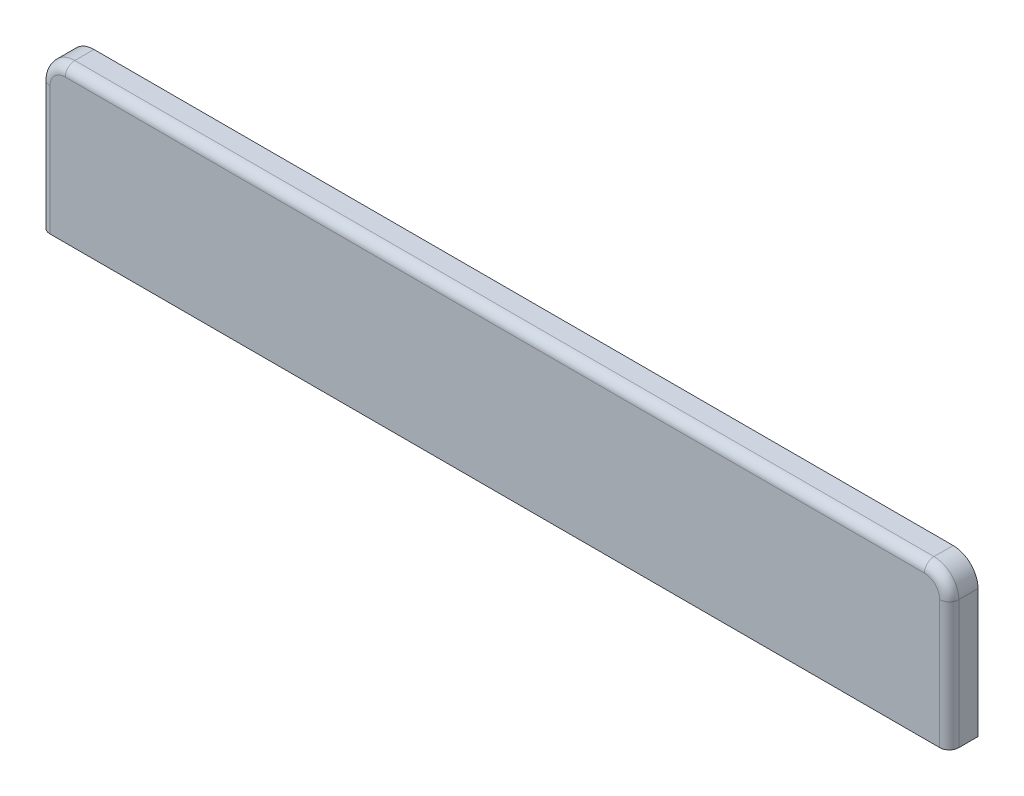
ISO-10303-21;
HEADER;
FILE_DESCRIPTION(('STEP AP214'),'2;1');
FILE_NAME('part.step','',(''),(''),'','','');
FILE_SCHEMA(('AUTOMOTIVE_DESIGN { 1 0 10303 214 1 1 1 1 }'));
ENDSEC;
DATA;
#1=APPLICATION_CONTEXT('core data for automotive mechanical design processes');
#2=APPLICATION_PROTOCOL_DEFINITION('international standard','automotive_design',2000,#1);
#3=PRODUCT_CONTEXT('',#1,'mechanical');
#4=PRODUCT('Part','Part','',(#3));
#5=PRODUCT_RELATED_PRODUCT_CATEGORY('part','',(#4));
#6=PRODUCT_DEFINITION_FORMATION('','',#4);
#7=PRODUCT_DEFINITION_CONTEXT('part definition',#1,'design');
#8=PRODUCT_DEFINITION('design','',#6,#7);
#9=PRODUCT_DEFINITION_SHAPE('','',#8);
#10=(LENGTH_UNIT() NAMED_UNIT(*) SI_UNIT(.MILLI.,.METRE.));
#11=(NAMED_UNIT(*) PLANE_ANGLE_UNIT() SI_UNIT($,.RADIAN.));
#12=(NAMED_UNIT(*) SI_UNIT($,.STERADIAN.) SOLID_ANGLE_UNIT());
#13=UNCERTAINTY_MEASURE_WITH_UNIT(LENGTH_MEASURE(1.E-05),#10,'distance_accuracy_value','');
#14=(GEOMETRIC_REPRESENTATION_CONTEXT(3) GLOBAL_UNCERTAINTY_ASSIGNED_CONTEXT((#13)) GLOBAL_UNIT_ASSIGNED_CONTEXT((#10,
#11,#12)) REPRESENTATION_CONTEXT('',''));
#15=CARTESIAN_POINT('',(0.,0.,0.));
#16=DIRECTION('',(0.,0.,1.));
#17=DIRECTION('',(1.,0.,0.));
#18=AXIS2_PLACEMENT_3D('',#15,#16,#17);
#19=CARTESIAN_POINT('',(301.625,101.6,19.05));
#20=DIRECTION('',(0.,-1.,0.));
#21=DIRECTION('',(1.,0.,0.));
#22=AXIS2_PLACEMENT_3D('',#19,#20,#21);
#23=PLANE('',#22);
#24=DIRECTION('',(0.,0.,-1.));
#25=VECTOR('',#24,1.);
#26=CARTESIAN_POINT('',(-285.115,101.6,19.05));
#27=LINE('',#26,#25);
#28=CARTESIAN_POINT('',(-285.115,101.6,0.));
#29=VERTEX_POINT('',#28);
#30=CARTESIAN_POINT('',(-285.115,101.6,12.7));
#31=VERTEX_POINT('',#30);
#32=EDGE_CURVE('E150',#29,#31,#27,.F.);
#33=ORIENTED_EDGE('',*,*,#32,.T.);
#34=DIRECTION('',(-1.,0.,0.));
#35=VECTOR('',#34,1.);
#36=CARTESIAN_POINT('',(285.115,101.6,12.7));
#37=LINE('',#36,#35);
#38=CARTESIAN_POINT('',(285.115,101.6,12.7));
#39=VERTEX_POINT('',#38);
#40=EDGE_CURVE('E174',#31,#39,#37,.F.);
#41=ORIENTED_EDGE('',*,*,#40,.T.);
#42=DIRECTION('',(0.,0.,-1.));
#43=VECTOR('',#42,1.);
#44=CARTESIAN_POINT('',(285.115,101.6,19.05));
#45=LINE('',#44,#43);
#46=CARTESIAN_POINT('',(285.115,101.6,0.));
#47=VERTEX_POINT('',#46);
#48=EDGE_CURVE('E148',#39,#47,#45,.T.);
#49=ORIENTED_EDGE('',*,*,#48,.T.);
#50=DIRECTION('',(-1.,0.,0.));
#51=VECTOR('',#50,1.);
#52=CARTESIAN_POINT('',(301.625,101.6,0.));
#53=LINE('',#52,#51);
#54=EDGE_CURVE('E128',#47,#29,#53,.T.);
#55=ORIENTED_EDGE('',*,*,#54,.T.);
#56=EDGE_LOOP('',(#33,#41,#49,#55));
#57=FACE_BOUND('',#56,.T.);
#58=ADVANCED_FACE('F36',(#57),#23,.F.);
#59=CARTESIAN_POINT('',(-301.625,101.6,19.05));
#60=DIRECTION('',(1.,0.,0.));
#61=DIRECTION('',(0.,0.,-1.));
#62=AXIS2_PLACEMENT_3D('',#59,#60,#61);
#63=PLANE('',#62);
#64=DIRECTION('',(0.,0.,-1.));
#65=VECTOR('',#64,1.);
#66=CARTESIAN_POINT('',(-301.625,0.,19.05));
#67=LINE('',#66,#65);
#68=CARTESIAN_POINT('',(-301.625,0.,12.7));
#69=VERTEX_POINT('',#68);
#70=CARTESIAN_POINT('',(-301.625,0.,0.));
#71=VERTEX_POINT('',#70);
#72=EDGE_CURVE('E108',#69,#71,#67,.T.);
#73=ORIENTED_EDGE('',*,*,#72,.F.);
#74=DIRECTION('',(0.,-1.,0.));
#75=VECTOR('',#74,1.);
#76=CARTESIAN_POINT('',(-301.625,85.09,12.7));
#77=LINE('',#76,#75);
#78=CARTESIAN_POINT('',(-301.625,85.09,12.7));
#79=VERTEX_POINT('',#78);
#80=EDGE_CURVE('E11',#69,#79,#77,.F.);
#81=ORIENTED_EDGE('',*,*,#80,.T.);
#82=DIRECTION('',(0.,0.,-1.));
#83=VECTOR('',#82,1.);
#84=CARTESIAN_POINT('',(-301.625,85.09,19.05));
#85=LINE('',#84,#83);
#86=CARTESIAN_POINT('',(-301.625,85.09,0.));
#87=VERTEX_POINT('',#86);
#88=EDGE_CURVE('E119',#79,#87,#85,.T.);
#89=ORIENTED_EDGE('',*,*,#88,.T.);
#90=DIRECTION('',(0.,-1.,0.));
#91=VECTOR('',#90,1.);
#92=CARTESIAN_POINT('',(-301.625,101.6,0.));
#93=LINE('',#92,#91);
#94=EDGE_CURVE('E123',#87,#71,#93,.T.);
#95=ORIENTED_EDGE('',*,*,#94,.T.);
#96=EDGE_LOOP('',(#73,#81,#89,#95));
#97=FACE_BOUND('',#96,.T.);
#98=ADVANCED_FACE('F124',(#97),#63,.F.);
#99=CARTESIAN_POINT('',(301.625,0.,19.05));
#100=DIRECTION('',(0.,1.,0.));
#101=DIRECTION('',(-1.,0.,0.));
#102=AXIS2_PLACEMENT_3D('',#99,#100,#101);
#103=PLANE('',#102);
#104=DIRECTION('',(0.,0.,-1.));
#105=VECTOR('',#104,1.);
#106=CARTESIAN_POINT('',(301.625,0.,19.05));
#107=LINE('',#106,#105);
#108=CARTESIAN_POINT('',(301.625,0.,12.7));
#109=VERTEX_POINT('',#108);
#110=CARTESIAN_POINT('',(301.625,0.,0.));
#111=VERTEX_POINT('',#110);
#112=EDGE_CURVE('E120',#109,#111,#107,.T.);
#113=ORIENTED_EDGE('',*,*,#112,.F.);
#114=CARTESIAN_POINT('',(295.275,0.,12.7));
#115=DIRECTION('',(0.,1.,0.));
#116=DIRECTION('',(-1.,0.,0.));
#117=AXIS2_PLACEMENT_3D('',#114,#115,#116);
#118=CIRCLE('',#117,6.35);
#119=CARTESIAN_POINT('',(295.275,0.,19.05));
#120=VERTEX_POINT('',#119);
#121=EDGE_CURVE('E170',#109,#120,#118,.F.);
#122=ORIENTED_EDGE('',*,*,#121,.T.);
#123=DIRECTION('',(1.,0.,0.));
#124=VECTOR('',#123,1.);
#125=CARTESIAN_POINT('',(301.625,0.,19.05));
#126=LINE('',#125,#124);
#127=CARTESIAN_POINT('',(-295.275,0.,19.05));
#128=VERTEX_POINT('',#127);
#129=EDGE_CURVE('E138',#128,#120,#126,.T.);
#130=ORIENTED_EDGE('',*,*,#129,.F.);
#131=CARTESIAN_POINT('',(-295.275,0.,12.7));
#132=DIRECTION('',(0.,1.,0.));
#133=DIRECTION('',(-1.,0.,0.));
#134=AXIS2_PLACEMENT_3D('',#131,#132,#133);
#135=CIRCLE('',#134,6.35);
#136=EDGE_CURVE('E117',#128,#69,#135,.F.);
#137=ORIENTED_EDGE('',*,*,#136,.T.);
#138=ORIENTED_EDGE('',*,*,#72,.T.);
#139=DIRECTION('',(1.,0.,0.));
#140=VECTOR('',#139,1.);
#141=CARTESIAN_POINT('',(301.625,0.,0.));
#142=LINE('',#141,#140);
#143=EDGE_CURVE('E113',#71,#111,#142,.T.);
#144=ORIENTED_EDGE('',*,*,#143,.T.);
#145=EDGE_LOOP('',(#113,#122,#130,#137,#138,#144));
#146=FACE_BOUND('',#145,.T.);
#147=ADVANCED_FACE('F111',(#146),#103,.F.);
#148=CARTESIAN_POINT('',(301.625,101.6,19.05));
#149=DIRECTION('',(-1.,0.,0.));
#150=DIRECTION('',(0.,0.,1.));
#151=AXIS2_PLACEMENT_3D('',#148,#149,#150);
#152=PLANE('',#151);
#153=DIRECTION('',(0.,0.,-1.));
#154=VECTOR('',#153,1.);
#155=CARTESIAN_POINT('',(301.625,85.0899999999999,19.05));
#156=LINE('',#155,#154);
#157=CARTESIAN_POINT('',(301.625,85.0899999999999,0.));
#158=VERTEX_POINT('',#157);
#159=CARTESIAN_POINT('',(301.625,85.0899999999999,12.7));
#160=VERTEX_POINT('',#159);
#161=EDGE_CURVE('E152',#158,#160,#156,.F.);
#162=ORIENTED_EDGE('',*,*,#161,.T.);
#163=DIRECTION('',(0.,1.,0.));
#164=VECTOR('',#163,1.);
#165=CARTESIAN_POINT('',(301.625,0.,12.7));
#166=LINE('',#165,#164);
#167=EDGE_CURVE('E167',#160,#109,#166,.F.);
#168=ORIENTED_EDGE('',*,*,#167,.T.);
#169=ORIENTED_EDGE('',*,*,#112,.T.);
#170=DIRECTION('',(0.,1.,0.));
#171=VECTOR('',#170,1.);
#172=CARTESIAN_POINT('',(301.625,101.6,0.));
#173=LINE('',#172,#171);
#174=EDGE_CURVE('E132',#111,#158,#173,.T.);
#175=ORIENTED_EDGE('',*,*,#174,.T.);
#176=EDGE_LOOP('',(#162,#168,#169,#175));
#177=FACE_BOUND('',#176,.T.);
#178=ADVANCED_FACE('F221',(#177),#152,.F.);
#179=CARTESIAN_POINT('',(0.,0.,19.05));
#180=DIRECTION('',(0.,0.,1.));
#181=DIRECTION('',(1.,0.,0.));
#182=AXIS2_PLACEMENT_3D('',#179,#180,#181);
#183=PLANE('',#182);
#184=ORIENTED_EDGE('',*,*,#129,.T.);
#185=DIRECTION('',(0.,1.,0.));
#186=VECTOR('',#185,1.);
#187=CARTESIAN_POINT('',(295.275,85.0899999999999,19.05));
#188=LINE('',#187,#186);
#189=CARTESIAN_POINT('',(295.275,85.0899999999999,19.05));
#190=VERTEX_POINT('',#189);
#191=EDGE_CURVE('E164',#120,#190,#188,.T.);
#192=ORIENTED_EDGE('',*,*,#191,.T.);
#193=CARTESIAN_POINT('',(285.115,85.0899999999999,19.05));
#194=DIRECTION('',(0.,0.,1.));
#195=DIRECTION('',(1.,0.,0.));
#196=AXIS2_PLACEMENT_3D('',#193,#194,#195);
#197=CIRCLE('',#196,10.16);
#198=CARTESIAN_POINT('',(285.115,95.2499999999999,19.05));
#199=VERTEX_POINT('',#198);
#200=EDGE_CURVE('E162',#190,#199,#197,.T.);
#201=ORIENTED_EDGE('',*,*,#200,.T.);
#202=DIRECTION('',(-1.,0.,0.));
#203=VECTOR('',#202,1.);
#204=CARTESIAN_POINT('',(-285.115,95.25,19.05));
#205=LINE('',#204,#203);
#206=CARTESIAN_POINT('',(-285.115,95.25,19.05));
#207=VERTEX_POINT('',#206);
#208=EDGE_CURVE('E159',#199,#207,#205,.T.);
#209=ORIENTED_EDGE('',*,*,#208,.T.);
#210=CARTESIAN_POINT('',(-285.115,85.09,19.05));
#211=DIRECTION('',(0.,0.,1.));
#212=DIRECTION('',(1.,0.,0.));
#213=AXIS2_PLACEMENT_3D('',#210,#211,#212);
#214=CIRCLE('',#213,10.16);
#215=CARTESIAN_POINT('',(-295.275,85.09,19.05));
#216=VERTEX_POINT('',#215);
#217=EDGE_CURVE('E157',#207,#216,#214,.T.);
#218=ORIENTED_EDGE('',*,*,#217,.T.);
#219=DIRECTION('',(0.,-1.,0.));
#220=VECTOR('',#219,1.);
#221=CARTESIAN_POINT('',(-295.275,0.,19.05));
#222=LINE('',#221,#220);
#223=EDGE_CURVE('E155',#216,#128,#222,.T.);
#224=ORIENTED_EDGE('',*,*,#223,.T.);
#225=EDGE_LOOP('',(#184,#192,#201,#209,#218,#224));
#226=FACE_BOUND('',#225,.T.);
#227=ADVANCED_FACE('F202',(#226),#183,.T.);
#228=CARTESIAN_POINT('',(0.,0.,0.));
#229=DIRECTION('',(0.,0.,1.));
#230=DIRECTION('',(1.,0.,0.));
#231=AXIS2_PLACEMENT_3D('',#228,#229,#230);
#232=PLANE('',#231);
#233=ORIENTED_EDGE('',*,*,#94,.F.);
#234=CARTESIAN_POINT('',(-285.115,85.09,0.));
#235=DIRECTION('',(0.,0.,1.));
#236=DIRECTION('',(1.,0.,0.));
#237=AXIS2_PLACEMENT_3D('',#234,#235,#236);
#238=CIRCLE('',#237,16.51);
#239=EDGE_CURVE('E146',#87,#29,#238,.F.);
#240=ORIENTED_EDGE('',*,*,#239,.T.);
#241=ORIENTED_EDGE('',*,*,#54,.F.);
#242=CARTESIAN_POINT('',(285.115,85.0899999999999,0.));
#243=DIRECTION('',(0.,0.,1.));
#244=DIRECTION('',(1.,0.,0.));
#245=AXIS2_PLACEMENT_3D('',#242,#243,#244);
#246=CIRCLE('',#245,16.51);
#247=EDGE_CURVE('E144',#47,#158,#246,.F.);
#248=ORIENTED_EDGE('',*,*,#247,.T.);
#249=ORIENTED_EDGE('',*,*,#174,.F.);
#250=ORIENTED_EDGE('',*,*,#143,.F.);
#251=EDGE_LOOP('',(#233,#240,#241,#248,#249,#250));
#252=FACE_BOUND('',#251,.T.);
#253=ADVANCED_FACE('F130',(#252),#232,.F.);
#254=CARTESIAN_POINT('',(-285.115,85.09,19.05));
#255=DIRECTION('',(0.,0.,-1.));
#256=DIRECTION('',(-1.,0.,0.));
#257=AXIS2_PLACEMENT_3D('',#254,#255,#256);
#258=CYLINDRICAL_SURFACE('',#257,16.51);
#259=ORIENTED_EDGE('',*,*,#88,.F.);
#260=CARTESIAN_POINT('',(-285.115,85.09,12.7));
#261=DIRECTION('',(0.,0.,1.));
#262=DIRECTION('',(1.,0.,0.));
#263=AXIS2_PLACEMENT_3D('',#260,#261,#262);
#264=CIRCLE('',#263,16.51);
#265=EDGE_CURVE('E46',#79,#31,#264,.F.);
#266=ORIENTED_EDGE('',*,*,#265,.T.);
#267=ORIENTED_EDGE('',*,*,#32,.F.);
#268=ORIENTED_EDGE('',*,*,#239,.F.);
#269=EDGE_LOOP('',(#259,#266,#267,#268));
#270=FACE_BOUND('',#269,.T.);
#271=ADVANCED_FACE('F238',(#270),#258,.T.);
#272=CARTESIAN_POINT('',(285.115,85.0899999999999,19.05));
#273=DIRECTION('',(0.,0.,-1.));
#274=DIRECTION('',(-1.,0.,0.));
#275=AXIS2_PLACEMENT_3D('',#272,#273,#274);
#276=CYLINDRICAL_SURFACE('',#275,16.51);
#277=ORIENTED_EDGE('',*,*,#48,.F.);
#278=CARTESIAN_POINT('',(285.115,85.0899999999999,12.7));
#279=DIRECTION('',(0.,0.,1.));
#280=DIRECTION('',(1.,0.,0.));
#281=AXIS2_PLACEMENT_3D('',#278,#279,#280);
#282=CIRCLE('',#281,16.51);
#283=EDGE_CURVE('E172',#39,#160,#282,.F.);
#284=ORIENTED_EDGE('',*,*,#283,.T.);
#285=ORIENTED_EDGE('',*,*,#161,.F.);
#286=ORIENTED_EDGE('',*,*,#247,.F.);
#287=EDGE_LOOP('',(#277,#284,#285,#286));
#288=FACE_BOUND('',#287,.T.);
#289=ADVANCED_FACE('F218',(#288),#276,.T.);
#290=CARTESIAN_POINT('',(-295.275,0.,12.7));
#291=DIRECTION('',(0.,1.,0.));
#292=DIRECTION('',(0.,0.,1.));
#293=AXIS2_PLACEMENT_3D('',#290,#291,#292);
#294=CYLINDRICAL_SURFACE('',#293,6.35);
#295=ORIENTED_EDGE('',*,*,#136,.F.);
#296=ORIENTED_EDGE('',*,*,#223,.F.);
#297=CARTESIAN_POINT('',(-295.275,85.09,12.7));
#298=DIRECTION('',(0.,1.,0.));
#299=DIRECTION('',(0.,0.,1.));
#300=AXIS2_PLACEMENT_3D('',#297,#298,#299);
#301=CIRCLE('',#300,6.35);
#302=EDGE_CURVE('E40',#79,#216,#301,.T.);
#303=ORIENTED_EDGE('',*,*,#302,.F.);
#304=ORIENTED_EDGE('',*,*,#80,.F.);
#305=EDGE_LOOP('',(#295,#296,#303,#304));
#306=FACE_BOUND('',#305,.T.);
#307=ADVANCED_FACE('F38',(#306),#294,.T.);
#308=CARTESIAN_POINT('',(-285.115,85.09,12.7));
#309=DIRECTION('',(0.,0.,1.));
#310=DIRECTION('',(1.,0.,0.));
#311=AXIS2_PLACEMENT_3D('',#308,#309,#310);
#312=TOROIDAL_SURFACE('',#311,10.16,6.35);
#313=ORIENTED_EDGE('',*,*,#302,.T.);
#314=ORIENTED_EDGE('',*,*,#217,.F.);
#315=CARTESIAN_POINT('',(-285.115,95.25,12.7));
#316=DIRECTION('',(1.,0.,0.));
#317=DIRECTION('',(0.,0.,-1.));
#318=AXIS2_PLACEMENT_3D('',#315,#316,#317);
#319=CIRCLE('',#318,6.35);
#320=EDGE_CURVE('E182',#31,#207,#319,.T.);
#321=ORIENTED_EDGE('',*,*,#320,.F.);
#322=ORIENTED_EDGE('',*,*,#265,.F.);
#323=EDGE_LOOP('',(#313,#314,#321,#322));
#324=FACE_BOUND('',#323,.T.);
#325=ADVANCED_FACE('F248',(#324),#312,.T.);
#326=CARTESIAN_POINT('',(0.,95.25,12.7));
#327=DIRECTION('',(1.,0.,0.));
#328=DIRECTION('',(0.,1.,0.));
#329=AXIS2_PLACEMENT_3D('',#326,#327,#328);
#330=CYLINDRICAL_SURFACE('',#329,6.35);
#331=ORIENTED_EDGE('',*,*,#320,.T.);
#332=ORIENTED_EDGE('',*,*,#208,.F.);
#333=CARTESIAN_POINT('',(285.115,95.2499999999999,12.7));
#334=DIRECTION('',(1.,0.,0.));
#335=DIRECTION('',(0.,0.,-1.));
#336=AXIS2_PLACEMENT_3D('',#333,#334,#335);
#337=CIRCLE('',#336,6.35);
#338=EDGE_CURVE('E180',#39,#199,#337,.T.);
#339=ORIENTED_EDGE('',*,*,#338,.F.);
#340=ORIENTED_EDGE('',*,*,#40,.F.);
#341=EDGE_LOOP('',(#331,#332,#339,#340));
#342=FACE_BOUND('',#341,.T.);
#343=ADVANCED_FACE('F214',(#342),#330,.T.);
#344=CARTESIAN_POINT('',(285.115,85.0899999999999,12.7));
#345=DIRECTION('',(0.,0.,1.));
#346=DIRECTION('',(1.,0.,0.));
#347=AXIS2_PLACEMENT_3D('',#344,#345,#346);
#348=TOROIDAL_SURFACE('',#347,10.16,6.35);
#349=ORIENTED_EDGE('',*,*,#338,.T.);
#350=ORIENTED_EDGE('',*,*,#200,.F.);
#351=CARTESIAN_POINT('',(295.275,85.0899999999999,12.7));
#352=DIRECTION('',(0.,-1.,0.));
#353=DIRECTION('',(0.,0.,-1.));
#354=AXIS2_PLACEMENT_3D('',#351,#352,#353);
#355=CIRCLE('',#354,6.35);
#356=EDGE_CURVE('E178',#160,#190,#355,.T.);
#357=ORIENTED_EDGE('',*,*,#356,.F.);
#358=ORIENTED_EDGE('',*,*,#283,.F.);
#359=EDGE_LOOP('',(#349,#350,#357,#358));
#360=FACE_BOUND('',#359,.T.);
#361=ADVANCED_FACE('F212',(#360),#348,.T.);
#362=CARTESIAN_POINT('',(295.275,0.,12.7));
#363=DIRECTION('',(0.,-1.,0.));
#364=DIRECTION('',(0.,0.,-1.));
#365=AXIS2_PLACEMENT_3D('',#362,#363,#364);
#366=CYLINDRICAL_SURFACE('',#365,6.35);
#367=ORIENTED_EDGE('',*,*,#121,.F.);
#368=ORIENTED_EDGE('',*,*,#167,.F.);
#369=ORIENTED_EDGE('',*,*,#356,.T.);
#370=ORIENTED_EDGE('',*,*,#191,.F.);
#371=EDGE_LOOP('',(#367,#368,#369,#370));
#372=FACE_BOUND('',#371,.T.);
#373=ADVANCED_FACE('F206',(#372),#366,.T.);
#374=CLOSED_SHELL('',(#58,#98,#147,#178,#227,#253,#271,#289,#307,#325,#343,#361,#373));
#375=MANIFOLD_SOLID_BREP('B2',#374);
#376=ADVANCED_BREP_SHAPE_REPRESENTATION('',(#18,#375),#14);
#377=SHAPE_DEFINITION_REPRESENTATION(#9,#376);
ENDSEC;
END-ISO-10303-21;
